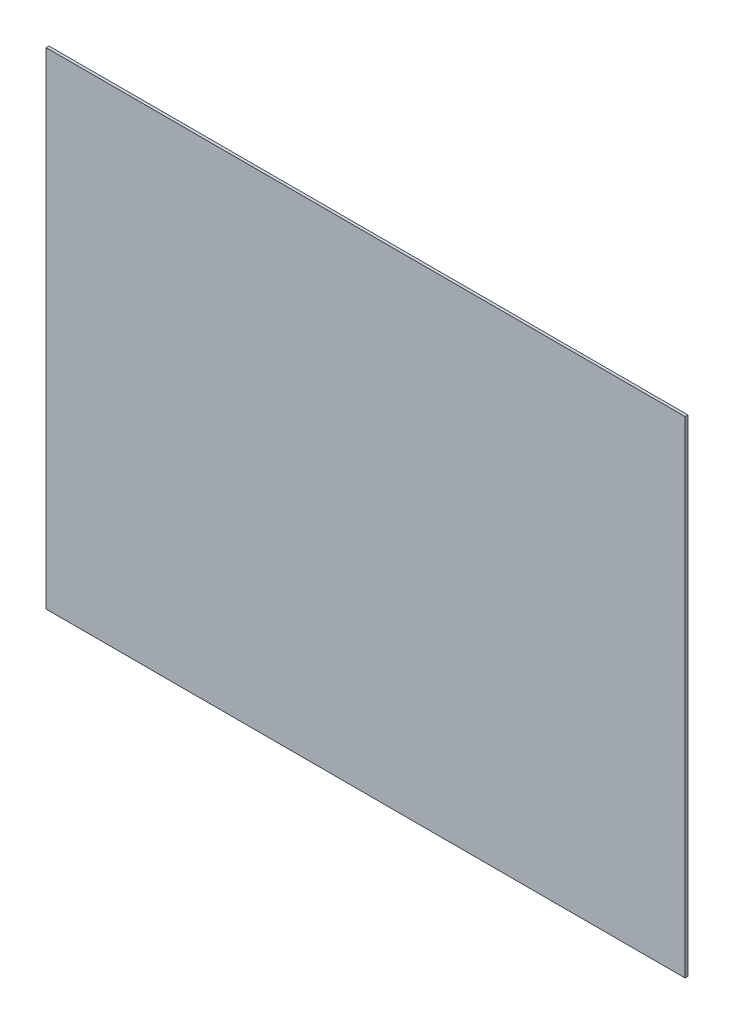
ISO-10303-21;
HEADER;
FILE_DESCRIPTION(('STEP AP214'),'2;1');
FILE_NAME('part.step','',(''),(''),'','','');
FILE_SCHEMA(('AUTOMOTIVE_DESIGN { 1 0 10303 214 1 1 1 1 }'));
ENDSEC;
DATA;
#1=APPLICATION_CONTEXT('core data for automotive mechanical design processes');
#2=APPLICATION_PROTOCOL_DEFINITION('international standard','automotive_design',2000,#1);
#3=PRODUCT_CONTEXT('',#1,'mechanical');
#4=PRODUCT('Part','Part','',(#3));
#5=PRODUCT_RELATED_PRODUCT_CATEGORY('part','',(#4));
#6=PRODUCT_DEFINITION_FORMATION('','',#4);
#7=PRODUCT_DEFINITION_CONTEXT('part definition',#1,'design');
#8=PRODUCT_DEFINITION('design','',#6,#7);
#9=PRODUCT_DEFINITION_SHAPE('','',#8);
#10=(LENGTH_UNIT() NAMED_UNIT(*) SI_UNIT(.MILLI.,.METRE.));
#11=(NAMED_UNIT(*) PLANE_ANGLE_UNIT() SI_UNIT($,.RADIAN.));
#12=(NAMED_UNIT(*) SI_UNIT($,.STERADIAN.) SOLID_ANGLE_UNIT());
#13=UNCERTAINTY_MEASURE_WITH_UNIT(LENGTH_MEASURE(1.E-05),#10,'distance_accuracy_value','');
#14=(GEOMETRIC_REPRESENTATION_CONTEXT(3) GLOBAL_UNCERTAINTY_ASSIGNED_CONTEXT((#13)) GLOBAL_UNIT_ASSIGNED_CONTEXT((#10,
#11,#12)) REPRESENTATION_CONTEXT('',''));
#15=CARTESIAN_POINT('',(0.,0.,0.));
#16=DIRECTION('',(0.,0.,1.));
#17=DIRECTION('',(1.,0.,0.));
#18=AXIS2_PLACEMENT_3D('',#15,#16,#17);
#19=CARTESIAN_POINT('',(56.5,-43.,0.5));
#20=DIRECTION('',(-1.,0.,0.));
#21=DIRECTION('',(0.,0.,1.));
#22=AXIS2_PLACEMENT_3D('',#19,#20,#21);
#23=PLANE('',#22);
#24=DIRECTION('',(0.,1.,0.));
#25=VECTOR('',#24,1.);
#26=CARTESIAN_POINT('',(56.5,-43.,0.));
#27=LINE('',#26,#25);
#28=CARTESIAN_POINT('',(56.5,-43.,0.));
#29=VERTEX_POINT('',#28);
#30=CARTESIAN_POINT('',(56.5,43.,0.));
#31=VERTEX_POINT('',#30);
#32=EDGE_CURVE('E105',#29,#31,#27,.T.);
#33=ORIENTED_EDGE('',*,*,#32,.T.);
#34=DIRECTION('',(0.,0.,-1.));
#35=VECTOR('',#34,1.);
#36=CARTESIAN_POINT('',(56.5,43.,0.5));
#37=LINE('',#36,#35);
#38=CARTESIAN_POINT('',(56.5,43.,0.5));
#39=VERTEX_POINT('',#38);
#40=EDGE_CURVE('E11',#39,#31,#37,.T.);
#41=ORIENTED_EDGE('',*,*,#40,.F.);
#42=DIRECTION('',(0.,1.,0.));
#43=VECTOR('',#42,1.);
#44=CARTESIAN_POINT('',(56.5,-43.,0.5));
#45=LINE('',#44,#43);
#46=CARTESIAN_POINT('',(56.5,-43.,0.5));
#47=VERTEX_POINT('',#46);
#48=EDGE_CURVE('E89',#47,#39,#45,.T.);
#49=ORIENTED_EDGE('',*,*,#48,.F.);
#50=DIRECTION('',(0.,0.,-1.));
#51=VECTOR('',#50,1.);
#52=CARTESIAN_POINT('',(56.5,-43.,0.5));
#53=LINE('',#52,#51);
#54=EDGE_CURVE('E98',#47,#29,#53,.T.);
#55=ORIENTED_EDGE('',*,*,#54,.T.);
#56=EDGE_LOOP('',(#33,#41,#49,#55));
#57=FACE_BOUND('',#56,.T.);
#58=ADVANCED_FACE('F39',(#57),#23,.F.);
#59=CARTESIAN_POINT('',(-56.5,43.,0.5));
#60=DIRECTION('',(0.,-1.,0.));
#61=DIRECTION('',(0.,0.,-1.));
#62=AXIS2_PLACEMENT_3D('',#59,#60,#61);
#63=PLANE('',#62);
#64=DIRECTION('',(-1.,0.,0.));
#65=VECTOR('',#64,1.);
#66=CARTESIAN_POINT('',(-56.5,43.,0.));
#67=LINE('',#66,#65);
#68=CARTESIAN_POINT('',(-56.5,43.,0.));
#69=VERTEX_POINT('',#68);
#70=EDGE_CURVE('E94',#31,#69,#67,.T.);
#71=ORIENTED_EDGE('',*,*,#70,.T.);
#72=DIRECTION('',(0.,0.,-1.));
#73=VECTOR('',#72,1.);
#74=CARTESIAN_POINT('',(-56.5,43.,0.5));
#75=LINE('',#74,#73);
#76=CARTESIAN_POINT('',(-56.5,43.,0.5));
#77=VERTEX_POINT('',#76);
#78=EDGE_CURVE('E50',#77,#69,#75,.T.);
#79=ORIENTED_EDGE('',*,*,#78,.F.);
#80=DIRECTION('',(-1.,0.,0.));
#81=VECTOR('',#80,1.);
#82=CARTESIAN_POINT('',(-56.5,43.,0.5));
#83=LINE('',#82,#81);
#84=EDGE_CURVE('E84',#39,#77,#83,.T.);
#85=ORIENTED_EDGE('',*,*,#84,.F.);
#86=ORIENTED_EDGE('',*,*,#40,.T.);
#87=EDGE_LOOP('',(#71,#79,#85,#86));
#88=FACE_BOUND('',#87,.T.);
#89=ADVANCED_FACE('F91',(#88),#63,.F.);
#90=CARTESIAN_POINT('',(-56.5,-43.,0.5));
#91=DIRECTION('',(1.,0.,0.));
#92=DIRECTION('',(0.,0.,-1.));
#93=AXIS2_PLACEMENT_3D('',#90,#91,#92);
#94=PLANE('',#93);
#95=DIRECTION('',(0.,-1.,0.));
#96=VECTOR('',#95,1.);
#97=CARTESIAN_POINT('',(-56.5,-43.,0.));
#98=LINE('',#97,#96);
#99=CARTESIAN_POINT('',(-56.5,-43.,0.));
#100=VERTEX_POINT('',#99);
#101=EDGE_CURVE('E75',#69,#100,#98,.T.);
#102=ORIENTED_EDGE('',*,*,#101,.T.);
#103=DIRECTION('',(0.,0.,-1.));
#104=VECTOR('',#103,1.);
#105=CARTESIAN_POINT('',(-56.5,-43.,0.5));
#106=LINE('',#105,#104);
#107=CARTESIAN_POINT('',(-56.5,-43.,0.5));
#108=VERTEX_POINT('',#107);
#109=EDGE_CURVE('E92',#108,#100,#106,.T.);
#110=ORIENTED_EDGE('',*,*,#109,.F.);
#111=DIRECTION('',(0.,-1.,0.));
#112=VECTOR('',#111,1.);
#113=CARTESIAN_POINT('',(-56.5,-43.,0.5));
#114=LINE('',#113,#112);
#115=EDGE_CURVE('E86',#77,#108,#114,.T.);
#116=ORIENTED_EDGE('',*,*,#115,.F.);
#117=ORIENTED_EDGE('',*,*,#78,.T.);
#118=EDGE_LOOP('',(#102,#110,#116,#117));
#119=FACE_BOUND('',#118,.T.);
#120=ADVANCED_FACE('F96',(#119),#94,.F.);
#121=CARTESIAN_POINT('',(-56.5,-43.,0.5));
#122=DIRECTION('',(0.,1.,0.));
#123=DIRECTION('',(0.,0.,1.));
#124=AXIS2_PLACEMENT_3D('',#121,#122,#123);
#125=PLANE('',#124);
#126=DIRECTION('',(1.,0.,0.));
#127=VECTOR('',#126,1.);
#128=CARTESIAN_POINT('',(-56.5,-43.,0.));
#129=LINE('',#128,#127);
#130=EDGE_CURVE('E79',#100,#29,#129,.T.);
#131=ORIENTED_EDGE('',*,*,#130,.T.);
#132=ORIENTED_EDGE('',*,*,#54,.F.);
#133=DIRECTION('',(1.,0.,0.));
#134=VECTOR('',#133,1.);
#135=CARTESIAN_POINT('',(-56.5,-43.,0.5));
#136=LINE('',#135,#134);
#137=EDGE_CURVE('E54',#108,#47,#136,.T.);
#138=ORIENTED_EDGE('',*,*,#137,.F.);
#139=ORIENTED_EDGE('',*,*,#109,.T.);
#140=EDGE_LOOP('',(#131,#132,#138,#139));
#141=FACE_BOUND('',#140,.T.);
#142=ADVANCED_FACE('F108',(#141),#125,.F.);
#143=CARTESIAN_POINT('',(0.,0.,0.5));
#144=DIRECTION('',(0.,0.,-1.));
#145=DIRECTION('',(-1.,0.,0.));
#146=AXIS2_PLACEMENT_3D('',#143,#144,#145);
#147=PLANE('',#146);
#148=ORIENTED_EDGE('',*,*,#48,.T.);
#149=ORIENTED_EDGE('',*,*,#84,.T.);
#150=ORIENTED_EDGE('',*,*,#115,.T.);
#151=ORIENTED_EDGE('',*,*,#137,.T.);
#152=EDGE_LOOP('',(#148,#149,#150,#151));
#153=FACE_BOUND('',#152,.T.);
#154=ADVANCED_FACE('F88',(#153),#147,.F.);
#155=CARTESIAN_POINT('',(0.,0.,0.));
#156=DIRECTION('',(0.,0.,-1.));
#157=DIRECTION('',(-1.,0.,0.));
#158=AXIS2_PLACEMENT_3D('',#155,#156,#157);
#159=PLANE('',#158);
#160=ORIENTED_EDGE('',*,*,#32,.F.);
#161=ORIENTED_EDGE('',*,*,#130,.F.);
#162=ORIENTED_EDGE('',*,*,#101,.F.);
#163=ORIENTED_EDGE('',*,*,#70,.F.);
#164=EDGE_LOOP('',(#160,#161,#162,#163));
#165=FACE_BOUND('',#164,.T.);
#166=ADVANCED_FACE('F115',(#165),#159,.T.);
#167=CLOSED_SHELL('',(#58,#89,#120,#142,#154,#166));
#168=MANIFOLD_SOLID_BREP('B2',#167);
#169=ADVANCED_BREP_SHAPE_REPRESENTATION('',(#18,#168),#14);
#170=SHAPE_DEFINITION_REPRESENTATION(#9,#169);
ENDSEC;
END-ISO-10303-21;
